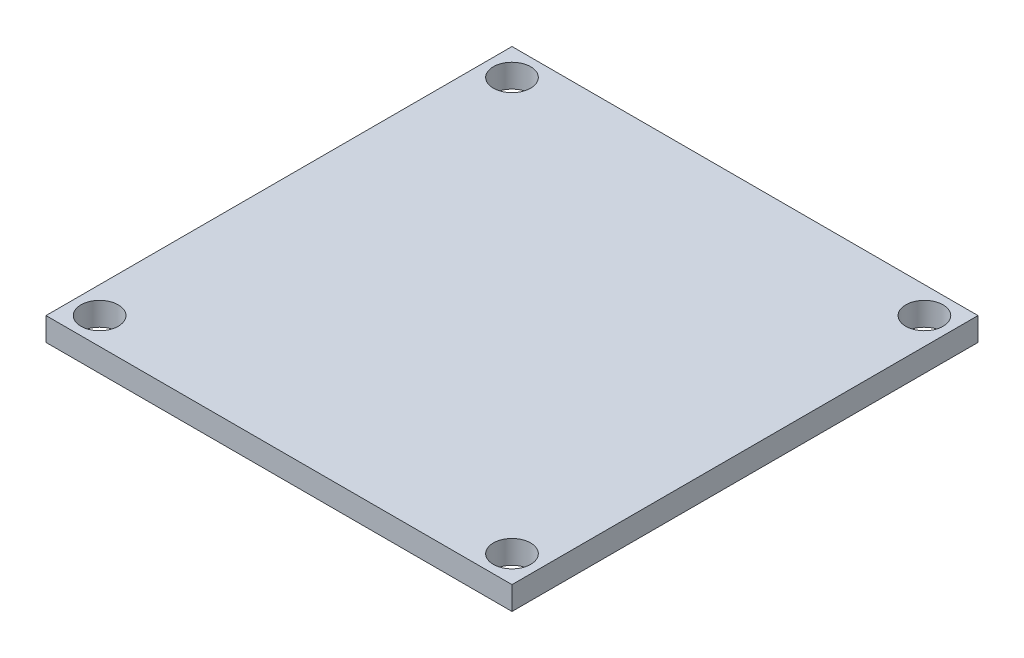
ISO-10303-21;
HEADER;
FILE_DESCRIPTION(('STEP AP214'),'2;1');
FILE_NAME('part.step','',(''),(''),'','','');
FILE_SCHEMA(('AUTOMOTIVE_DESIGN { 1 0 10303 214 1 1 1 1 }'));
ENDSEC;
DATA;
#1=APPLICATION_CONTEXT('core data for automotive mechanical design processes');
#2=APPLICATION_PROTOCOL_DEFINITION('international standard','automotive_design',2000,#1);
#3=PRODUCT_CONTEXT('',#1,'mechanical');
#4=PRODUCT('Part','Part','',(#3));
#5=PRODUCT_RELATED_PRODUCT_CATEGORY('part','',(#4));
#6=PRODUCT_DEFINITION_FORMATION('','',#4);
#7=PRODUCT_DEFINITION_CONTEXT('part definition',#1,'design');
#8=PRODUCT_DEFINITION('design','',#6,#7);
#9=PRODUCT_DEFINITION_SHAPE('','',#8);
#10=(LENGTH_UNIT() NAMED_UNIT(*) SI_UNIT(.MILLI.,.METRE.));
#11=(NAMED_UNIT(*) PLANE_ANGLE_UNIT() SI_UNIT($,.RADIAN.));
#12=(NAMED_UNIT(*) SI_UNIT($,.STERADIAN.) SOLID_ANGLE_UNIT());
#13=UNCERTAINTY_MEASURE_WITH_UNIT(LENGTH_MEASURE(1.E-05),#10,'distance_accuracy_value','');
#14=(GEOMETRIC_REPRESENTATION_CONTEXT(3) GLOBAL_UNCERTAINTY_ASSIGNED_CONTEXT((#13)) GLOBAL_UNIT_ASSIGNED_CONTEXT((#10,
#11,#12)) REPRESENTATION_CONTEXT('',''));
#15=CARTESIAN_POINT('',(0.,0.,0.));
#16=DIRECTION('',(0.,0.,1.));
#17=DIRECTION('',(1.,0.,0.));
#18=AXIS2_PLACEMENT_3D('',#15,#16,#17);
#19=CARTESIAN_POINT('',(-20.,2.,-20.));
#20=DIRECTION('',(1.,0.,0.));
#21=DIRECTION('',(0.,0.,-1.));
#22=AXIS2_PLACEMENT_3D('',#19,#20,#21);
#23=PLANE('',#22);
#24=DIRECTION('',(0.,0.,1.));
#25=VECTOR('',#24,1.);
#26=CARTESIAN_POINT('',(-20.,0.,-20.));
#27=LINE('',#26,#25);
#28=CARTESIAN_POINT('',(-20.,0.,-20.));
#29=VERTEX_POINT('',#28);
#30=CARTESIAN_POINT('',(-20.,0.,20.));
#31=VERTEX_POINT('',#30);
#32=EDGE_CURVE('E96',#29,#31,#27,.T.);
#33=ORIENTED_EDGE('',*,*,#32,.T.);
#34=DIRECTION('',(0.,-1.,0.));
#35=VECTOR('',#34,1.);
#36=CARTESIAN_POINT('',(-20.,2.,20.));
#37=LINE('',#36,#35);
#38=CARTESIAN_POINT('',(-20.,2.,20.));
#39=VERTEX_POINT('',#38);
#40=EDGE_CURVE('E11',#39,#31,#37,.T.);
#41=ORIENTED_EDGE('',*,*,#40,.F.);
#42=DIRECTION('',(0.,0.,1.));
#43=VECTOR('',#42,1.);
#44=CARTESIAN_POINT('',(-20.,2.,-20.));
#45=LINE('',#44,#43);
#46=CARTESIAN_POINT('',(-20.,2.,-20.));
#47=VERTEX_POINT('',#46);
#48=EDGE_CURVE('E84',#47,#39,#45,.T.);
#49=ORIENTED_EDGE('',*,*,#48,.F.);
#50=DIRECTION('',(0.,-1.,0.));
#51=VECTOR('',#50,1.);
#52=CARTESIAN_POINT('',(-20.,2.,-20.));
#53=LINE('',#52,#51);
#54=EDGE_CURVE('E92',#47,#29,#53,.T.);
#55=ORIENTED_EDGE('',*,*,#54,.T.);
#56=EDGE_LOOP('',(#33,#41,#49,#55));
#57=FACE_BOUND('',#56,.T.);
#58=ADVANCED_FACE('F33',(#57),#23,.F.);
#59=CARTESIAN_POINT('',(-20.,2.,20.));
#60=DIRECTION('',(0.,0.,-1.));
#61=DIRECTION('',(-1.,0.,0.));
#62=AXIS2_PLACEMENT_3D('',#59,#60,#61);
#63=PLANE('',#62);
#64=DIRECTION('',(1.,0.,0.));
#65=VECTOR('',#64,1.);
#66=CARTESIAN_POINT('',(-20.,0.,20.));
#67=LINE('',#66,#65);
#68=CARTESIAN_POINT('',(20.,0.,20.));
#69=VERTEX_POINT('',#68);
#70=EDGE_CURVE('E88',#31,#69,#67,.T.);
#71=ORIENTED_EDGE('',*,*,#70,.T.);
#72=DIRECTION('',(0.,-1.,0.));
#73=VECTOR('',#72,1.);
#74=CARTESIAN_POINT('',(20.,2.,20.));
#75=LINE('',#74,#73);
#76=CARTESIAN_POINT('',(20.,2.,20.));
#77=VERTEX_POINT('',#76);
#78=EDGE_CURVE('E41',#77,#69,#75,.T.);
#79=ORIENTED_EDGE('',*,*,#78,.F.);
#80=DIRECTION('',(1.,0.,0.));
#81=VECTOR('',#80,1.);
#82=CARTESIAN_POINT('',(-20.,2.,20.));
#83=LINE('',#82,#81);
#84=EDGE_CURVE('E79',#39,#77,#83,.T.);
#85=ORIENTED_EDGE('',*,*,#84,.F.);
#86=ORIENTED_EDGE('',*,*,#40,.T.);
#87=EDGE_LOOP('',(#71,#79,#85,#86));
#88=FACE_BOUND('',#87,.T.);
#89=ADVANCED_FACE('F87',(#88),#63,.F.);
#90=CARTESIAN_POINT('',(20.,2.,-20.));
#91=DIRECTION('',(-1.,0.,0.));
#92=DIRECTION('',(0.,0.,1.));
#93=AXIS2_PLACEMENT_3D('',#90,#91,#92);
#94=PLANE('',#93);
#95=DIRECTION('',(0.,0.,-1.));
#96=VECTOR('',#95,1.);
#97=CARTESIAN_POINT('',(20.,0.,-20.));
#98=LINE('',#97,#96);
#99=CARTESIAN_POINT('',(20.,0.,-20.));
#100=VERTEX_POINT('',#99);
#101=EDGE_CURVE('E66',#69,#100,#98,.T.);
#102=ORIENTED_EDGE('',*,*,#101,.T.);
#103=DIRECTION('',(0.,-1.,0.));
#104=VECTOR('',#103,1.);
#105=CARTESIAN_POINT('',(20.,2.,-20.));
#106=LINE('',#105,#104);
#107=CARTESIAN_POINT('',(20.,2.,-20.));
#108=VERTEX_POINT('',#107);
#109=EDGE_CURVE('E89',#108,#100,#106,.T.);
#110=ORIENTED_EDGE('',*,*,#109,.F.);
#111=DIRECTION('',(0.,0.,-1.));
#112=VECTOR('',#111,1.);
#113=CARTESIAN_POINT('',(20.,2.,-20.));
#114=LINE('',#113,#112);
#115=EDGE_CURVE('E82',#77,#108,#114,.T.);
#116=ORIENTED_EDGE('',*,*,#115,.F.);
#117=ORIENTED_EDGE('',*,*,#78,.T.);
#118=EDGE_LOOP('',(#102,#110,#116,#117));
#119=FACE_BOUND('',#118,.T.);
#120=ADVANCED_FACE('F90',(#119),#94,.F.);
#121=CARTESIAN_POINT('',(-20.,2.,-20.));
#122=DIRECTION('',(0.,0.,1.));
#123=DIRECTION('',(1.,0.,0.));
#124=AXIS2_PLACEMENT_3D('',#121,#122,#123);
#125=PLANE('',#124);
#126=DIRECTION('',(-1.,0.,0.));
#127=VECTOR('',#126,1.);
#128=CARTESIAN_POINT('',(-20.,0.,-20.));
#129=LINE('',#128,#127);
#130=EDGE_CURVE('E72',#100,#29,#129,.T.);
#131=ORIENTED_EDGE('',*,*,#130,.T.);
#132=ORIENTED_EDGE('',*,*,#54,.F.);
#133=DIRECTION('',(-1.,0.,0.));
#134=VECTOR('',#133,1.);
#135=CARTESIAN_POINT('',(-20.,2.,-20.));
#136=LINE('',#135,#134);
#137=EDGE_CURVE('E49',#108,#47,#136,.T.);
#138=ORIENTED_EDGE('',*,*,#137,.F.);
#139=ORIENTED_EDGE('',*,*,#109,.T.);
#140=EDGE_LOOP('',(#131,#132,#138,#139));
#141=FACE_BOUND('',#140,.T.);
#142=ADVANCED_FACE('F104',(#141),#125,.F.);
#143=CARTESIAN_POINT('',(0.,2.,0.));
#144=DIRECTION('',(0.,1.,0.));
#145=DIRECTION('',(0.,0.,1.));
#146=AXIS2_PLACEMENT_3D('',#143,#144,#145);
#147=PLANE('',#146);
#148=CARTESIAN_POINT('',(17.7,2.,-17.700000000001));
#149=DIRECTION('',(0.,1.,0.));
#150=DIRECTION('',(0.,0.,1.));
#151=AXIS2_PLACEMENT_3D('',#148,#149,#150);
#152=CIRCLE('',#151,1.60000000000103);
#153=CARTESIAN_POINT('',(17.7,2.,-16.1));
#154=VERTEX_POINT('',#153);
#155=EDGE_CURVE('E128',#154,#154,#152,.T.);
#156=ORIENTED_EDGE('',*,*,#155,.F.);
#157=EDGE_LOOP('',(#156));
#158=FACE_BOUND('',#157,.T.);
#159=CARTESIAN_POINT('',(17.700000000001,2.,17.699999999999));
#160=DIRECTION('',(0.,1.,0.));
#161=DIRECTION('',(0.,0.,1.));
#162=AXIS2_PLACEMENT_3D('',#159,#160,#161);
#163=CIRCLE('',#162,1.6000000000014);
#164=CARTESIAN_POINT('',(17.700000000001,2.,19.3000000000004));
#165=VERTEX_POINT('',#164);
#166=EDGE_CURVE('E122',#165,#165,#163,.T.);
#167=ORIENTED_EDGE('',*,*,#166,.F.);
#168=EDGE_LOOP('',(#167));
#169=FACE_BOUND('',#168,.T.);
#170=CARTESIAN_POINT('',(-17.699999999999,2.,17.7));
#171=DIRECTION('',(0.,1.,0.));
#172=DIRECTION('',(0.,0.,1.));
#173=AXIS2_PLACEMENT_3D('',#170,#171,#172);
#174=CIRCLE('',#173,1.60000000000052);
#175=CARTESIAN_POINT('',(-17.699999999999,2.,19.3000000000005));
#176=VERTEX_POINT('',#175);
#177=EDGE_CURVE('E116',#176,#176,#174,.T.);
#178=ORIENTED_EDGE('',*,*,#177,.F.);
#179=EDGE_LOOP('',(#178));
#180=FACE_BOUND('',#179,.T.);
#181=CARTESIAN_POINT('',(-17.7,2.,-17.7));
#182=DIRECTION('',(0.,1.,0.));
#183=DIRECTION('',(0.,0.,1.));
#184=AXIS2_PLACEMENT_3D('',#181,#182,#183);
#185=CIRCLE('',#184,1.6);
#186=CARTESIAN_POINT('',(-17.7,2.,-16.1));
#187=VERTEX_POINT('',#186);
#188=EDGE_CURVE('E110',#187,#187,#185,.T.);
#189=ORIENTED_EDGE('',*,*,#188,.F.);
#190=EDGE_LOOP('',(#189));
#191=FACE_BOUND('',#190,.T.);
#192=ORIENTED_EDGE('',*,*,#48,.T.);
#193=ORIENTED_EDGE('',*,*,#84,.T.);
#194=ORIENTED_EDGE('',*,*,#115,.T.);
#195=ORIENTED_EDGE('',*,*,#137,.T.);
#196=EDGE_LOOP('',(#192,#193,#194,#195));
#197=FACE_BOUND('',#196,.T.);
#198=ADVANCED_FACE('F80',(#158,#169,#180,#191,#197),#147,.T.);
#199=CARTESIAN_POINT('',(0.,0.,0.));
#200=DIRECTION('',(0.,1.,0.));
#201=DIRECTION('',(0.,0.,1.));
#202=AXIS2_PLACEMENT_3D('',#199,#200,#201);
#203=PLANE('',#202);
#204=CARTESIAN_POINT('',(17.7,0.,-17.700000000001));
#205=DIRECTION('',(0.,1.,0.));
#206=DIRECTION('',(0.,0.,1.));
#207=AXIS2_PLACEMENT_3D('',#204,#205,#206);
#208=CIRCLE('',#207,1.60000000000103);
#209=CARTESIAN_POINT('',(17.7,0.,-16.1));
#210=VERTEX_POINT('',#209);
#211=EDGE_CURVE('E113',#210,#210,#208,.T.);
#212=ORIENTED_EDGE('',*,*,#211,.T.);
#213=EDGE_LOOP('',(#212));
#214=FACE_BOUND('',#213,.T.);
#215=CARTESIAN_POINT('',(17.700000000001,0.,17.699999999999));
#216=DIRECTION('',(0.,1.,0.));
#217=DIRECTION('',(0.,0.,1.));
#218=AXIS2_PLACEMENT_3D('',#215,#216,#217);
#219=CIRCLE('',#218,1.6000000000014);
#220=CARTESIAN_POINT('',(17.700000000001,0.,19.3000000000004));
#221=VERTEX_POINT('',#220);
#222=EDGE_CURVE('E125',#221,#221,#219,.T.);
#223=ORIENTED_EDGE('',*,*,#222,.T.);
#224=EDGE_LOOP('',(#223));
#225=FACE_BOUND('',#224,.T.);
#226=CARTESIAN_POINT('',(-17.699999999999,0.,17.7));
#227=DIRECTION('',(0.,1.,0.));
#228=DIRECTION('',(0.,0.,1.));
#229=AXIS2_PLACEMENT_3D('',#226,#227,#228);
#230=CIRCLE('',#229,1.60000000000052);
#231=CARTESIAN_POINT('',(-17.699999999999,0.,19.3000000000005));
#232=VERTEX_POINT('',#231);
#233=EDGE_CURVE('E119',#232,#232,#230,.T.);
#234=ORIENTED_EDGE('',*,*,#233,.T.);
#235=EDGE_LOOP('',(#234));
#236=FACE_BOUND('',#235,.T.);
#237=CARTESIAN_POINT('',(-17.7,0.,-17.7));
#238=DIRECTION('',(0.,1.,0.));
#239=DIRECTION('',(0.,0.,1.));
#240=AXIS2_PLACEMENT_3D('',#237,#238,#239);
#241=CIRCLE('',#240,1.6);
#242=CARTESIAN_POINT('',(-17.7,0.,-16.1));
#243=VERTEX_POINT('',#242);
#244=EDGE_CURVE('E99',#243,#243,#241,.T.);
#245=ORIENTED_EDGE('',*,*,#244,.T.);
#246=EDGE_LOOP('',(#245));
#247=FACE_BOUND('',#246,.T.);
#248=ORIENTED_EDGE('',*,*,#32,.F.);
#249=ORIENTED_EDGE('',*,*,#130,.F.);
#250=ORIENTED_EDGE('',*,*,#101,.F.);
#251=ORIENTED_EDGE('',*,*,#70,.F.);
#252=EDGE_LOOP('',(#248,#249,#250,#251));
#253=FACE_BOUND('',#252,.T.);
#254=ADVANCED_FACE('F107',(#214,#225,#236,#247,#253),#203,.F.);
#255=CARTESIAN_POINT('',(-17.7,0.,-17.7));
#256=DIRECTION('',(0.,1.,0.));
#257=DIRECTION('',(0.,0.,1.));
#258=AXIS2_PLACEMENT_3D('',#255,#256,#257);
#259=CYLINDRICAL_SURFACE('',#258,1.6);
#260=ORIENTED_EDGE('',*,*,#244,.F.);
#261=EDGE_LOOP('',(#260));
#262=FACE_BOUND('',#261,.T.);
#263=ORIENTED_EDGE('',*,*,#188,.T.);
#264=EDGE_LOOP('',(#263));
#265=FACE_BOUND('',#264,.T.);
#266=ADVANCED_FACE('F152',(#262,#265),#259,.F.);
#267=CARTESIAN_POINT('',(-17.699999999999,0.,17.7));
#268=DIRECTION('',(0.,1.,0.));
#269=DIRECTION('',(0.,0.,1.));
#270=AXIS2_PLACEMENT_3D('',#267,#268,#269);
#271=CYLINDRICAL_SURFACE('',#270,1.60000000000052);
#272=ORIENTED_EDGE('',*,*,#233,.F.);
#273=EDGE_LOOP('',(#272));
#274=FACE_BOUND('',#273,.T.);
#275=ORIENTED_EDGE('',*,*,#177,.T.);
#276=EDGE_LOOP('',(#275));
#277=FACE_BOUND('',#276,.T.);
#278=ADVANCED_FACE('F154',(#274,#277),#271,.F.);
#279=CARTESIAN_POINT('',(17.700000000001,0.,17.699999999999));
#280=DIRECTION('',(0.,1.,0.));
#281=DIRECTION('',(0.,0.,1.));
#282=AXIS2_PLACEMENT_3D('',#279,#280,#281);
#283=CYLINDRICAL_SURFACE('',#282,1.6000000000014);
#284=ORIENTED_EDGE('',*,*,#222,.F.);
#285=EDGE_LOOP('',(#284));
#286=FACE_BOUND('',#285,.T.);
#287=ORIENTED_EDGE('',*,*,#166,.T.);
#288=EDGE_LOOP('',(#287));
#289=FACE_BOUND('',#288,.T.);
#290=ADVANCED_FACE('F139',(#286,#289),#283,.F.);
#291=CARTESIAN_POINT('',(17.7,0.,-17.700000000001));
#292=DIRECTION('',(0.,1.,0.));
#293=DIRECTION('',(0.,0.,1.));
#294=AXIS2_PLACEMENT_3D('',#291,#292,#293);
#295=CYLINDRICAL_SURFACE('',#294,1.60000000000103);
#296=ORIENTED_EDGE('',*,*,#211,.F.);
#297=EDGE_LOOP('',(#296));
#298=FACE_BOUND('',#297,.T.);
#299=ORIENTED_EDGE('',*,*,#155,.T.);
#300=EDGE_LOOP('',(#299));
#301=FACE_BOUND('',#300,.T.);
#302=ADVANCED_FACE('F136',(#298,#301),#295,.F.);
#303=CLOSED_SHELL('',(#58,#89,#120,#142,#198,#254,#266,#278,#290,#302));
#304=MANIFOLD_SOLID_BREP('B2',#303);
#305=ADVANCED_BREP_SHAPE_REPRESENTATION('',(#18,#304),#14);
#306=SHAPE_DEFINITION_REPRESENTATION(#9,#305);
ENDSEC;
END-ISO-10303-21;
